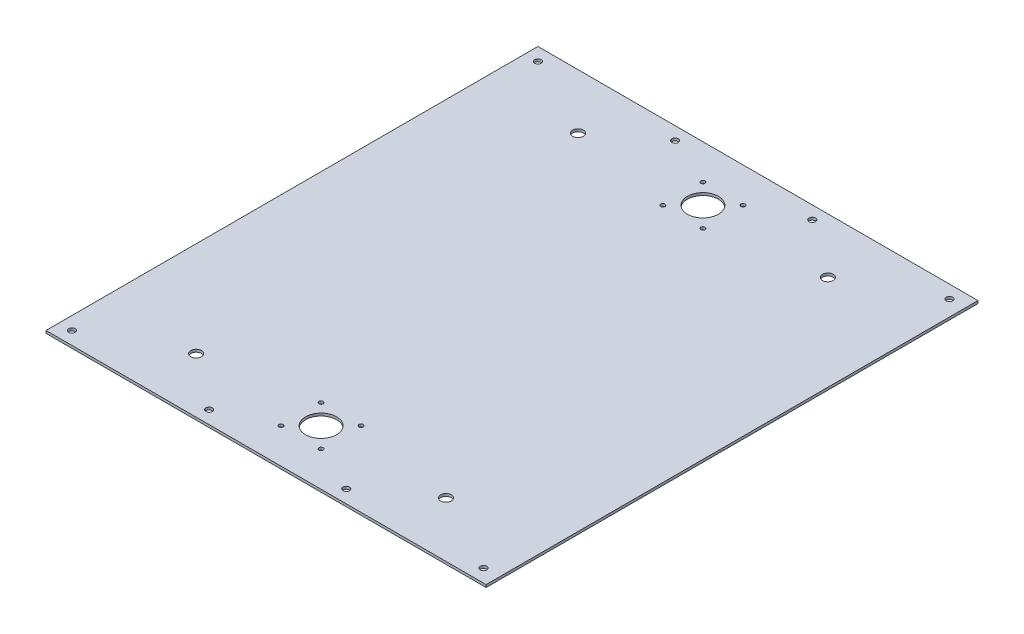
ISO-10303-21;
HEADER;
FILE_DESCRIPTION(('STEP AP214'),'2;1');
FILE_NAME('part.step','',(''),(''),'','','');
FILE_SCHEMA(('AUTOMOTIVE_DESIGN { 1 0 10303 214 1 1 1 1 }'));
ENDSEC;
DATA;
#1=APPLICATION_CONTEXT('core data for automotive mechanical design processes');
#2=APPLICATION_PROTOCOL_DEFINITION('international standard','automotive_design',2000,#1);
#3=PRODUCT_CONTEXT('',#1,'mechanical');
#4=PRODUCT('Part','Part','',(#3));
#5=PRODUCT_RELATED_PRODUCT_CATEGORY('part','',(#4));
#6=PRODUCT_DEFINITION_FORMATION('','',#4);
#7=PRODUCT_DEFINITION_CONTEXT('part definition',#1,'design');
#8=PRODUCT_DEFINITION('design','',#6,#7);
#9=PRODUCT_DEFINITION_SHAPE('','',#8);
#10=(LENGTH_UNIT() NAMED_UNIT(*) SI_UNIT(.MILLI.,.METRE.));
#11=(NAMED_UNIT(*) PLANE_ANGLE_UNIT() SI_UNIT($,.RADIAN.));
#12=(NAMED_UNIT(*) SI_UNIT($,.STERADIAN.) SOLID_ANGLE_UNIT());
#13=UNCERTAINTY_MEASURE_WITH_UNIT(LENGTH_MEASURE(1.E-05),#10,'distance_accuracy_value','');
#14=(GEOMETRIC_REPRESENTATION_CONTEXT(3) GLOBAL_UNCERTAINTY_ASSIGNED_CONTEXT((#13)) GLOBAL_UNIT_ASSIGNED_CONTEXT((#10,
#11,#12)) REPRESENTATION_CONTEXT('',''));
#15=CARTESIAN_POINT('',(0.,0.,0.));
#16=DIRECTION('',(0.,0.,1.));
#17=DIRECTION('',(1.,0.,0.));
#18=AXIS2_PLACEMENT_3D('',#15,#16,#17);
#19=CARTESIAN_POINT('',(0.,2.,0.));
#20=DIRECTION('',(0.,1.,0.));
#21=DIRECTION('',(0.,0.,1.));
#22=AXIS2_PLACEMENT_3D('',#19,#20,#21);
#23=PLANE('',#22);
#24=CARTESIAN_POINT('',(15.4999994388272,2.,-131.999999265587));
#25=DIRECTION('',(0.,-1.,0.));
#26=DIRECTION('',(0.,0.,-1.));
#27=AXIS2_PLACEMENT_3D('',#24,#25,#26);
#28=CIRCLE('',#27,1.64999961201001);
#29=CARTESIAN_POINT('',(15.4999994388272,2.,-133.649998877597));
#30=VERTEX_POINT('',#29);
#31=EDGE_CURVE('E194',#30,#30,#28,.T.);
#32=ORIENTED_EDGE('',*,*,#31,.T.);
#33=EDGE_LOOP('',(#32));
#34=FACE_BOUND('',#33,.T.);
#35=CARTESIAN_POINT('',(-15.5000005611728,2.,-131.999999265588));
#36=DIRECTION('',(0.,-1.,0.));
#37=DIRECTION('',(0.,0.,-1.));
#38=AXIS2_PLACEMENT_3D('',#35,#36,#37);
#39=CIRCLE('',#38,1.64999961201001);
#40=CARTESIAN_POINT('',(-15.5000005611728,2.,-133.649998877598));
#41=VERTEX_POINT('',#40);
#42=EDGE_CURVE('E201',#41,#41,#39,.T.);
#43=ORIENTED_EDGE('',*,*,#42,.T.);
#44=EDGE_LOOP('',(#43));
#45=FACE_BOUND('',#44,.T.);
#46=CARTESIAN_POINT('',(-15.5000005611726,2.,-162.999999265588));
#47=DIRECTION('',(0.,-1.,0.));
#48=DIRECTION('',(0.,0.,-1.));
#49=AXIS2_PLACEMENT_3D('',#46,#47,#48);
#50=CIRCLE('',#49,1.64999961201001);
#51=CARTESIAN_POINT('',(-15.5000005611726,2.,-164.649998877598));
#52=VERTEX_POINT('',#51);
#53=EDGE_CURVE('E207',#52,#52,#50,.T.);
#54=ORIENTED_EDGE('',*,*,#53,.T.);
#55=EDGE_LOOP('',(#54));
#56=FACE_BOUND('',#55,.T.);
#57=CARTESIAN_POINT('',(96.499999368108,2.,-147.499999005089));
#58=DIRECTION('',(0.,-1.,0.));
#59=DIRECTION('',(0.,0.,-1.));
#60=AXIS2_PLACEMENT_3D('',#57,#58,#59);
#61=CIRCLE('',#60,4.15000009933431);
#62=CARTESIAN_POINT('',(96.499999368108,2.,-151.649999104423));
#63=VERTEX_POINT('',#62);
#64=EDGE_CURVE('E183',#63,#63,#61,.T.);
#65=ORIENTED_EDGE('',*,*,#64,.T.);
#66=EDGE_LOOP('',(#65));
#67=FACE_BOUND('',#66,.T.);
#68=CARTESIAN_POINT('',(15.4999994388274,2.,-162.999999265587));
#69=DIRECTION('',(0.,-1.,0.));
#70=DIRECTION('',(0.,0.,-1.));
#71=AXIS2_PLACEMENT_3D('',#68,#69,#70);
#72=CIRCLE('',#71,1.64999961201001);
#73=CARTESIAN_POINT('',(15.4999994388274,2.,-164.649998877597));
#74=VERTEX_POINT('',#73);
#75=EDGE_CURVE('E164',#74,#74,#72,.T.);
#76=ORIENTED_EDGE('',*,*,#75,.T.);
#77=EDGE_LOOP('',(#76));
#78=FACE_BOUND('',#77,.T.);
#79=CARTESIAN_POINT('',(-15.4999993894449,2.,162.999999867049));
#80=DIRECTION('',(0.,-1.,0.));
#81=DIRECTION('',(0.,0.,-1.));
#82=AXIS2_PLACEMENT_3D('',#79,#80,#81);
#83=CIRCLE('',#82,1.65000019614936);
#84=CARTESIAN_POINT('',(-15.4999993894449,2.,161.3499996709));
#85=VERTEX_POINT('',#84);
#86=EDGE_CURVE('E170',#85,#85,#83,.T.);
#87=ORIENTED_EDGE('',*,*,#86,.T.);
#88=EDGE_LOOP('',(#87));
#89=FACE_BOUND('',#88,.T.);
#90=CARTESIAN_POINT('',(-15.4999993894446,2.,131.999999867049));
#91=DIRECTION('',(0.,-1.,0.));
#92=DIRECTION('',(0.,0.,-1.));
#93=AXIS2_PLACEMENT_3D('',#90,#91,#92);
#94=CIRCLE('',#93,1.65000019614936);
#95=CARTESIAN_POINT('',(-15.4999993894446,2.,130.3499996709));
#96=VERTEX_POINT('',#95);
#97=EDGE_CURVE('E171',#96,#96,#94,.T.);
#98=ORIENTED_EDGE('',*,*,#97,.T.);
#99=EDGE_LOOP('',(#98));
#100=FACE_BOUND('',#99,.T.);
#101=CARTESIAN_POINT('',(15.5000006105554,2.,131.999999867049));
#102=DIRECTION('',(0.,-1.,0.));
#103=DIRECTION('',(0.,0.,-1.));
#104=AXIS2_PLACEMENT_3D('',#101,#102,#103);
#105=CIRCLE('',#104,1.65000019614936);
#106=CARTESIAN_POINT('',(15.5000006105554,2.,130.3499996709));
#107=VERTEX_POINT('',#106);
#108=EDGE_CURVE('E182',#107,#107,#105,.T.);
#109=ORIENTED_EDGE('',*,*,#108,.T.);
#110=EDGE_LOOP('',(#109));
#111=FACE_BOUND('',#110,.T.);
#112=CARTESIAN_POINT('',(0.,2.,147.499999035042));
#113=DIRECTION('',(0.,-1.,0.));
#114=DIRECTION('',(0.,0.,-1.));
#115=AXIS2_PLACEMENT_3D('',#112,#113,#114);
#116=CIRCLE('',#115,12.);
#117=CARTESIAN_POINT('',(0.,2.,135.499999035042));
#118=VERTEX_POINT('',#117);
#119=EDGE_CURVE('E219',#118,#118,#116,.T.);
#120=ORIENTED_EDGE('',*,*,#119,.T.);
#121=EDGE_LOOP('',(#120));
#122=FACE_BOUND('',#121,.T.);
#123=CARTESIAN_POINT('',(0.,2.,-147.499999158167));
#124=DIRECTION('',(0.,-1.,0.));
#125=DIRECTION('',(0.,0.,-1.));
#126=AXIS2_PLACEMENT_3D('',#123,#124,#125);
#127=CIRCLE('',#126,12.);
#128=CARTESIAN_POINT('',(0.,2.,-159.499999158167));
#129=VERTEX_POINT('',#128);
#130=EDGE_CURVE('E218',#129,#129,#127,.T.);
#131=ORIENTED_EDGE('',*,*,#130,.T.);
#132=EDGE_LOOP('',(#131));
#133=FACE_BOUND('',#132,.T.);
#134=CARTESIAN_POINT('',(96.4999995632542,2.,147.499999035042));
#135=DIRECTION('',(0.,-1.,0.));
#136=DIRECTION('',(0.,0.,-1.));
#137=AXIS2_PLACEMENT_3D('',#134,#135,#136);
#138=CIRCLE('',#137,4.15000002607921);
#139=CARTESIAN_POINT('',(96.4999995632542,2.,143.349999008963));
#140=VERTEX_POINT('',#139);
#141=EDGE_CURVE('E225',#140,#140,#138,.T.);
#142=ORIENTED_EDGE('',*,*,#141,.T.);
#143=EDGE_LOOP('',(#142));
#144=FACE_BOUND('',#143,.T.);
#145=CARTESIAN_POINT('',(-96.5000178161831,2.,147.499999068419));
#146=DIRECTION('',(0.,-1.,0.));
#147=DIRECTION('',(0.,0.,-1.));
#148=AXIS2_PLACEMENT_3D('',#145,#146,#147);
#149=CIRCLE('',#148,4.14999997483809);
#150=CARTESIAN_POINT('',(-96.5000178161831,2.,143.349999093581));
#151=VERTEX_POINT('',#150);
#152=EDGE_CURVE('E231',#151,#151,#149,.T.);
#153=ORIENTED_EDGE('',*,*,#152,.T.);
#154=EDGE_LOOP('',(#153));
#155=FACE_BOUND('',#154,.T.);
#156=CARTESIAN_POINT('',(-96.4999996591489,2.,-147.499999158167));
#157=DIRECTION('',(0.,-1.,0.));
#158=DIRECTION('',(0.,0.,-1.));
#159=AXIS2_PLACEMENT_3D('',#156,#157,#158);
#160=CIRCLE('',#159,4.14999992410953);
#161=CARTESIAN_POINT('',(-96.4999996591489,2.,-151.649999082277));
#162=VERTEX_POINT('',#161);
#163=EDGE_CURVE('E195',#162,#162,#160,.T.);
#164=ORIENTED_EDGE('',*,*,#163,.T.);
#165=EDGE_LOOP('',(#164));
#166=FACE_BOUND('',#165,.T.);
#167=CARTESIAN_POINT('',(15.5000006105551,2.,162.999999867049));
#168=DIRECTION('',(0.,-1.,0.));
#169=DIRECTION('',(0.,0.,-1.));
#170=AXIS2_PLACEMENT_3D('',#167,#168,#169);
#171=CIRCLE('',#170,1.65000019614936);
#172=CARTESIAN_POINT('',(15.5000006105551,2.,161.3499996709));
#173=VERTEX_POINT('',#172);
#174=EDGE_CURVE('E158',#173,#173,#171,.T.);
#175=ORIENTED_EDGE('',*,*,#174,.T.);
#176=EDGE_LOOP('',(#175));
#177=FACE_BOUND('',#176,.T.);
#178=CARTESIAN_POINT('',(158.000000000004,2.,180.));
#179=DIRECTION('',(0.,1.,0.));
#180=DIRECTION('',(0.,0.,1.));
#181=AXIS2_PLACEMENT_3D('',#178,#179,#180);
#182=CIRCLE('',#181,2.5);
#183=CARTESIAN_POINT('',(158.000000000004,2.,182.5));
#184=VERTEX_POINT('',#183);
#185=EDGE_CURVE('E146',#184,#184,#182,.T.);
#186=ORIENTED_EDGE('',*,*,#185,.F.);
#187=EDGE_LOOP('',(#186));
#188=FACE_BOUND('',#187,.T.);
#189=CARTESIAN_POINT('',(-53.9999999999962,2.,180.));
#190=DIRECTION('',(0.,1.,0.));
#191=DIRECTION('',(0.,0.,1.));
#192=AXIS2_PLACEMENT_3D('',#189,#190,#191);
#193=CIRCLE('',#192,2.5);
#194=CARTESIAN_POINT('',(-53.9999999999962,2.,182.5));
#195=VERTEX_POINT('',#194);
#196=EDGE_CURVE('E134',#195,#195,#193,.T.);
#197=ORIENTED_EDGE('',*,*,#196,.F.);
#198=EDGE_LOOP('',(#197));
#199=FACE_BOUND('',#198,.T.);
#200=CARTESIAN_POINT('',(52.,2.,-180.));
#201=DIRECTION('',(0.,1.,0.));
#202=DIRECTION('',(0.,0.,1.));
#203=AXIS2_PLACEMENT_3D('',#200,#201,#202);
#204=CIRCLE('',#203,2.5);
#205=CARTESIAN_POINT('',(52.,2.,-177.5));
#206=VERTEX_POINT('',#205);
#207=EDGE_CURVE('E122',#206,#206,#204,.T.);
#208=ORIENTED_EDGE('',*,*,#207,.F.);
#209=EDGE_LOOP('',(#208));
#210=FACE_BOUND('',#209,.T.);
#211=CARTESIAN_POINT('',(-160.,2.,-180.));
#212=DIRECTION('',(0.,1.,0.));
#213=DIRECTION('',(0.,0.,1.));
#214=AXIS2_PLACEMENT_3D('',#211,#212,#213);
#215=CIRCLE('',#214,2.5);
#216=CARTESIAN_POINT('',(-160.,2.,-177.5));
#217=VERTEX_POINT('',#216);
#218=EDGE_CURVE('E101',#217,#217,#215,.T.);
#219=ORIENTED_EDGE('',*,*,#218,.F.);
#220=EDGE_LOOP('',(#219));
#221=FACE_BOUND('',#220,.T.);
#222=DIRECTION('',(0.,0.,1.));
#223=VECTOR('',#222,1.);
#224=CARTESIAN_POINT('',(-170.,2.,190.));
#225=LINE('',#224,#223);
#226=CARTESIAN_POINT('',(-170.,2.,-190.));
#227=VERTEX_POINT('',#226);
#228=CARTESIAN_POINT('',(-170.,2.,190.));
#229=VERTEX_POINT('',#228);
#230=EDGE_CURVE('E86',#227,#229,#225,.T.);
#231=ORIENTED_EDGE('',*,*,#230,.T.);
#232=DIRECTION('',(1.,0.,0.));
#233=VECTOR('',#232,1.);
#234=CARTESIAN_POINT('',(170.,2.,190.));
#235=LINE('',#234,#233);
#236=CARTESIAN_POINT('',(170.,2.,190.));
#237=VERTEX_POINT('',#236);
#238=EDGE_CURVE('E81',#229,#237,#235,.T.);
#239=ORIENTED_EDGE('',*,*,#238,.T.);
#240=DIRECTION('',(0.,0.,-1.));
#241=VECTOR('',#240,1.);
#242=CARTESIAN_POINT('',(170.,2.,190.));
#243=LINE('',#242,#241);
#244=CARTESIAN_POINT('',(170.,2.,-190.));
#245=VERTEX_POINT('',#244);
#246=EDGE_CURVE('E84',#237,#245,#243,.T.);
#247=ORIENTED_EDGE('',*,*,#246,.T.);
#248=DIRECTION('',(-1.,0.,0.));
#249=VECTOR('',#248,1.);
#250=CARTESIAN_POINT('',(170.,2.,-190.));
#251=LINE('',#250,#249);
#252=EDGE_CURVE('E51',#245,#227,#251,.T.);
#253=ORIENTED_EDGE('',*,*,#252,.T.);
#254=EDGE_LOOP('',(#231,#239,#247,#253));
#255=FACE_BOUND('',#254,.T.);
#256=CARTESIAN_POINT('',(-54.,2.,-180.));
#257=DIRECTION('',(0.,1.,0.));
#258=DIRECTION('',(0.,0.,1.));
#259=AXIS2_PLACEMENT_3D('',#256,#257,#258);
#260=CIRCLE('',#259,2.5);
#261=CARTESIAN_POINT('',(-54.,2.,-177.5));
#262=VERTEX_POINT('',#261);
#263=EDGE_CURVE('E116',#262,#262,#260,.T.);
#264=ORIENTED_EDGE('',*,*,#263,.F.);
#265=EDGE_LOOP('',(#264));
#266=FACE_BOUND('',#265,.T.);
#267=CARTESIAN_POINT('',(158.,2.,-180.));
#268=DIRECTION('',(0.,1.,0.));
#269=DIRECTION('',(0.,0.,1.));
#270=AXIS2_PLACEMENT_3D('',#267,#268,#269);
#271=CIRCLE('',#270,2.5);
#272=CARTESIAN_POINT('',(158.,2.,-177.5));
#273=VERTEX_POINT('',#272);
#274=EDGE_CURVE('E128',#273,#273,#271,.T.);
#275=ORIENTED_EDGE('',*,*,#274,.F.);
#276=EDGE_LOOP('',(#275));
#277=FACE_BOUND('',#276,.T.);
#278=CARTESIAN_POINT('',(52.0000000000038,2.,180.));
#279=DIRECTION('',(0.,1.,0.));
#280=DIRECTION('',(0.,0.,1.));
#281=AXIS2_PLACEMENT_3D('',#278,#279,#280);
#282=CIRCLE('',#281,2.5);
#283=CARTESIAN_POINT('',(52.0000000000038,2.,182.5));
#284=VERTEX_POINT('',#283);
#285=EDGE_CURVE('E140',#284,#284,#282,.T.);
#286=ORIENTED_EDGE('',*,*,#285,.F.);
#287=EDGE_LOOP('',(#286));
#288=FACE_BOUND('',#287,.T.);
#289=CARTESIAN_POINT('',(-159.999999999996,2.,180.));
#290=DIRECTION('',(0.,1.,0.));
#291=DIRECTION('',(0.,0.,1.));
#292=AXIS2_PLACEMENT_3D('',#289,#290,#291);
#293=CIRCLE('',#292,2.5);
#294=CARTESIAN_POINT('',(-159.999999999996,2.,182.5));
#295=VERTEX_POINT('',#294);
#296=EDGE_CURVE('E152',#295,#295,#293,.T.);
#297=ORIENTED_EDGE('',*,*,#296,.F.);
#298=EDGE_LOOP('',(#297));
#299=FACE_BOUND('',#298,.T.);
#300=ADVANCED_FACE('F34',(#34,#45,#56,#67,#78,#89,#100,#111,#122,#133,#144,#155,#166,#177,#188,
#199,#210,#221,#255,#266,#277,#288,#299),#23,.T.);
#301=CARTESIAN_POINT('',(0.,0.,0.));
#302=DIRECTION('',(0.,1.,0.));
#303=DIRECTION('',(0.,0.,1.));
#304=AXIS2_PLACEMENT_3D('',#301,#302,#303);
#305=PLANE('',#304);
#306=CARTESIAN_POINT('',(15.4999994388272,0.,-131.999999265587));
#307=DIRECTION('',(0.,-1.,0.));
#308=DIRECTION('',(0.,0.,-1.));
#309=AXIS2_PLACEMENT_3D('',#306,#307,#308);
#310=CIRCLE('',#309,1.64999961201001);
#311=CARTESIAN_POINT('',(15.4999994388272,0.,-133.649998877597));
#312=VERTEX_POINT('',#311);
#313=EDGE_CURVE('E191',#312,#312,#310,.T.);
#314=ORIENTED_EDGE('',*,*,#313,.F.);
#315=EDGE_LOOP('',(#314));
#316=FACE_BOUND('',#315,.T.);
#317=CARTESIAN_POINT('',(-15.5000005611728,0.,-131.999999265588));
#318=DIRECTION('',(0.,-1.,0.));
#319=DIRECTION('',(0.,0.,-1.));
#320=AXIS2_PLACEMENT_3D('',#317,#318,#319);
#321=CIRCLE('',#320,1.64999961201001);
#322=CARTESIAN_POINT('',(-15.5000005611728,0.,-133.649998877598));
#323=VERTEX_POINT('',#322);
#324=EDGE_CURVE('E198',#323,#323,#321,.T.);
#325=ORIENTED_EDGE('',*,*,#324,.F.);
#326=EDGE_LOOP('',(#325));
#327=FACE_BOUND('',#326,.T.);
#328=CARTESIAN_POINT('',(-15.5000005611726,0.,-162.999999265588));
#329=DIRECTION('',(0.,-1.,0.));
#330=DIRECTION('',(0.,0.,-1.));
#331=AXIS2_PLACEMENT_3D('',#328,#329,#330);
#332=CIRCLE('',#331,1.64999961201001);
#333=CARTESIAN_POINT('',(-15.5000005611726,0.,-164.649998877598));
#334=VERTEX_POINT('',#333);
#335=EDGE_CURVE('E204',#334,#334,#332,.T.);
#336=ORIENTED_EDGE('',*,*,#335,.F.);
#337=EDGE_LOOP('',(#336));
#338=FACE_BOUND('',#337,.T.);
#339=CARTESIAN_POINT('',(96.499999368108,0.,-147.499999005089));
#340=DIRECTION('',(0.,-1.,0.));
#341=DIRECTION('',(0.,0.,-1.));
#342=AXIS2_PLACEMENT_3D('',#339,#340,#341);
#343=CIRCLE('',#342,4.15000009933431);
#344=CARTESIAN_POINT('',(96.499999368108,0.,-151.649999104423));
#345=VERTEX_POINT('',#344);
#346=EDGE_CURVE('E210',#345,#345,#343,.T.);
#347=ORIENTED_EDGE('',*,*,#346,.F.);
#348=EDGE_LOOP('',(#347));
#349=FACE_BOUND('',#348,.T.);
#350=CARTESIAN_POINT('',(15.4999994388274,0.,-162.999999265587));
#351=DIRECTION('',(0.,-1.,0.));
#352=DIRECTION('',(0.,0.,-1.));
#353=AXIS2_PLACEMENT_3D('',#350,#351,#352);
#354=CIRCLE('',#353,1.64999961201001);
#355=CARTESIAN_POINT('',(15.4999994388274,0.,-164.649998877597));
#356=VERTEX_POINT('',#355);
#357=EDGE_CURVE('E174',#356,#356,#354,.T.);
#358=ORIENTED_EDGE('',*,*,#357,.F.);
#359=EDGE_LOOP('',(#358));
#360=FACE_BOUND('',#359,.T.);
#361=CARTESIAN_POINT('',(-15.4999993894449,0.,162.999999867049));
#362=DIRECTION('',(0.,-1.,0.));
#363=DIRECTION('',(0.,0.,-1.));
#364=AXIS2_PLACEMENT_3D('',#361,#362,#363);
#365=CIRCLE('',#364,1.65000019614936);
#366=CARTESIAN_POINT('',(-15.4999993894449,0.,161.3499996709));
#367=VERTEX_POINT('',#366);
#368=EDGE_CURVE('E167',#367,#367,#365,.T.);
#369=ORIENTED_EDGE('',*,*,#368,.F.);
#370=EDGE_LOOP('',(#369));
#371=FACE_BOUND('',#370,.T.);
#372=CARTESIAN_POINT('',(-15.4999993894446,0.,131.999999867049));
#373=DIRECTION('',(0.,-1.,0.));
#374=DIRECTION('',(0.,0.,-1.));
#375=AXIS2_PLACEMENT_3D('',#372,#373,#374);
#376=CIRCLE('',#375,1.65000019614936);
#377=CARTESIAN_POINT('',(-15.4999993894446,0.,130.3499996709));
#378=VERTEX_POINT('',#377);
#379=EDGE_CURVE('E186',#378,#378,#376,.T.);
#380=ORIENTED_EDGE('',*,*,#379,.F.);
#381=EDGE_LOOP('',(#380));
#382=FACE_BOUND('',#381,.T.);
#383=CARTESIAN_POINT('',(15.5000006105554,0.,131.999999867049));
#384=DIRECTION('',(0.,-1.,0.));
#385=DIRECTION('',(0.,0.,-1.));
#386=AXIS2_PLACEMENT_3D('',#383,#384,#385);
#387=CIRCLE('',#386,1.65000019614936);
#388=CARTESIAN_POINT('',(15.5000006105554,0.,130.3499996709));
#389=VERTEX_POINT('',#388);
#390=EDGE_CURVE('E179',#389,#389,#387,.T.);
#391=ORIENTED_EDGE('',*,*,#390,.F.);
#392=EDGE_LOOP('',(#391));
#393=FACE_BOUND('',#392,.T.);
#394=CARTESIAN_POINT('',(0.,0.,147.499999035042));
#395=DIRECTION('',(0.,-1.,0.));
#396=DIRECTION('',(0.,0.,-1.));
#397=AXIS2_PLACEMENT_3D('',#394,#395,#396);
#398=CIRCLE('',#397,12.);
#399=CARTESIAN_POINT('',(0.,0.,135.499999035042));
#400=VERTEX_POINT('',#399);
#401=EDGE_CURVE('E239',#400,#400,#398,.T.);
#402=ORIENTED_EDGE('',*,*,#401,.F.);
#403=EDGE_LOOP('',(#402));
#404=FACE_BOUND('',#403,.T.);
#405=CARTESIAN_POINT('',(0.,0.,-147.499999158167));
#406=DIRECTION('',(0.,-1.,0.));
#407=DIRECTION('',(0.,0.,-1.));
#408=AXIS2_PLACEMENT_3D('',#405,#406,#407);
#409=CIRCLE('',#408,12.);
#410=CARTESIAN_POINT('',(0.,0.,-159.499999158167));
#411=VERTEX_POINT('',#410);
#412=EDGE_CURVE('E215',#411,#411,#409,.T.);
#413=ORIENTED_EDGE('',*,*,#412,.F.);
#414=EDGE_LOOP('',(#413));
#415=FACE_BOUND('',#414,.T.);
#416=CARTESIAN_POINT('',(96.4999995632542,0.,147.499999035042));
#417=DIRECTION('',(0.,-1.,0.));
#418=DIRECTION('',(0.,0.,-1.));
#419=AXIS2_PLACEMENT_3D('',#416,#417,#418);
#420=CIRCLE('',#419,4.15000002607921);
#421=CARTESIAN_POINT('',(96.4999995632542,0.,143.349999008963));
#422=VERTEX_POINT('',#421);
#423=EDGE_CURVE('E222',#422,#422,#420,.T.);
#424=ORIENTED_EDGE('',*,*,#423,.F.);
#425=EDGE_LOOP('',(#424));
#426=FACE_BOUND('',#425,.T.);
#427=CARTESIAN_POINT('',(-96.5000178161831,0.,147.499999068419));
#428=DIRECTION('',(0.,-1.,0.));
#429=DIRECTION('',(0.,0.,-1.));
#430=AXIS2_PLACEMENT_3D('',#427,#428,#429);
#431=CIRCLE('',#430,4.14999997483809);
#432=CARTESIAN_POINT('',(-96.5000178161831,0.,143.349999093581));
#433=VERTEX_POINT('',#432);
#434=EDGE_CURVE('E228',#433,#433,#431,.T.);
#435=ORIENTED_EDGE('',*,*,#434,.F.);
#436=EDGE_LOOP('',(#435));
#437=FACE_BOUND('',#436,.T.);
#438=CARTESIAN_POINT('',(-96.4999996591489,0.,-147.499999158167));
#439=DIRECTION('',(0.,-1.,0.));
#440=DIRECTION('',(0.,0.,-1.));
#441=AXIS2_PLACEMENT_3D('',#438,#439,#440);
#442=CIRCLE('',#441,4.14999992410953);
#443=CARTESIAN_POINT('',(-96.4999996591489,0.,-151.649999082277));
#444=VERTEX_POINT('',#443);
#445=EDGE_CURVE('E234',#444,#444,#442,.T.);
#446=ORIENTED_EDGE('',*,*,#445,.F.);
#447=EDGE_LOOP('',(#446));
#448=FACE_BOUND('',#447,.T.);
#449=CARTESIAN_POINT('',(15.5000006105551,0.,162.999999867049));
#450=DIRECTION('',(0.,-1.,0.));
#451=DIRECTION('',(0.,0.,-1.));
#452=AXIS2_PLACEMENT_3D('',#449,#450,#451);
#453=CIRCLE('',#452,1.65000019614936);
#454=CARTESIAN_POINT('',(15.5000006105551,0.,161.3499996709));
#455=VERTEX_POINT('',#454);
#456=EDGE_CURVE('E161',#455,#455,#453,.T.);
#457=ORIENTED_EDGE('',*,*,#456,.F.);
#458=EDGE_LOOP('',(#457));
#459=FACE_BOUND('',#458,.T.);
#460=DIRECTION('',(0.,0.,1.));
#461=VECTOR('',#460,1.);
#462=CARTESIAN_POINT('',(-170.,0.,190.));
#463=LINE('',#462,#461);
#464=CARTESIAN_POINT('',(-170.,0.,-190.));
#465=VERTEX_POINT('',#464);
#466=CARTESIAN_POINT('',(-170.,0.,190.));
#467=VERTEX_POINT('',#466);
#468=EDGE_CURVE('E98',#465,#467,#463,.T.);
#469=ORIENTED_EDGE('',*,*,#468,.F.);
#470=DIRECTION('',(-1.,0.,0.));
#471=VECTOR('',#470,1.);
#472=CARTESIAN_POINT('',(170.,0.,-190.));
#473=LINE('',#472,#471);
#474=CARTESIAN_POINT('',(170.,0.,-190.));
#475=VERTEX_POINT('',#474);
#476=EDGE_CURVE('E74',#475,#465,#473,.T.);
#477=ORIENTED_EDGE('',*,*,#476,.F.);
#478=DIRECTION('',(0.,0.,-1.));
#479=VECTOR('',#478,1.);
#480=CARTESIAN_POINT('',(170.,0.,190.));
#481=LINE('',#480,#479);
#482=CARTESIAN_POINT('',(170.,0.,190.));
#483=VERTEX_POINT('',#482);
#484=EDGE_CURVE('E68',#483,#475,#481,.T.);
#485=ORIENTED_EDGE('',*,*,#484,.F.);
#486=DIRECTION('',(1.,0.,0.));
#487=VECTOR('',#486,1.);
#488=CARTESIAN_POINT('',(170.,0.,190.));
#489=LINE('',#488,#487);
#490=EDGE_CURVE('E90',#467,#483,#489,.T.);
#491=ORIENTED_EDGE('',*,*,#490,.F.);
#492=EDGE_LOOP('',(#469,#477,#485,#491));
#493=FACE_BOUND('',#492,.T.);
#494=CARTESIAN_POINT('',(-160.,0.,-180.));
#495=DIRECTION('',(0.,1.,0.));
#496=DIRECTION('',(0.,0.,1.));
#497=AXIS2_PLACEMENT_3D('',#494,#495,#496);
#498=CIRCLE('',#497,2.5);
#499=CARTESIAN_POINT('',(-160.,0.,-177.5));
#500=VERTEX_POINT('',#499);
#501=EDGE_CURVE('E113',#500,#500,#498,.T.);
#502=ORIENTED_EDGE('',*,*,#501,.T.);
#503=EDGE_LOOP('',(#502));
#504=FACE_BOUND('',#503,.T.);
#505=CARTESIAN_POINT('',(-54.,0.,-180.));
#506=DIRECTION('',(0.,1.,0.));
#507=DIRECTION('',(0.,0.,1.));
#508=AXIS2_PLACEMENT_3D('',#505,#506,#507);
#509=CIRCLE('',#508,2.5);
#510=CARTESIAN_POINT('',(-54.,0.,-177.5));
#511=VERTEX_POINT('',#510);
#512=EDGE_CURVE('E119',#511,#511,#509,.T.);
#513=ORIENTED_EDGE('',*,*,#512,.T.);
#514=EDGE_LOOP('',(#513));
#515=FACE_BOUND('',#514,.T.);
#516=CARTESIAN_POINT('',(52.,0.,-180.));
#517=DIRECTION('',(0.,1.,0.));
#518=DIRECTION('',(0.,0.,1.));
#519=AXIS2_PLACEMENT_3D('',#516,#517,#518);
#520=CIRCLE('',#519,2.5);
#521=CARTESIAN_POINT('',(52.,0.,-177.5));
#522=VERTEX_POINT('',#521);
#523=EDGE_CURVE('E125',#522,#522,#520,.T.);
#524=ORIENTED_EDGE('',*,*,#523,.T.);
#525=EDGE_LOOP('',(#524));
#526=FACE_BOUND('',#525,.T.);
#527=CARTESIAN_POINT('',(158.,0.,-180.));
#528=DIRECTION('',(0.,1.,0.));
#529=DIRECTION('',(0.,0.,1.));
#530=AXIS2_PLACEMENT_3D('',#527,#528,#529);
#531=CIRCLE('',#530,2.5);
#532=CARTESIAN_POINT('',(158.,0.,-177.5));
#533=VERTEX_POINT('',#532);
#534=EDGE_CURVE('E131',#533,#533,#531,.T.);
#535=ORIENTED_EDGE('',*,*,#534,.T.);
#536=EDGE_LOOP('',(#535));
#537=FACE_BOUND('',#536,.T.);
#538=CARTESIAN_POINT('',(-53.9999999999962,0.,180.));
#539=DIRECTION('',(0.,1.,0.));
#540=DIRECTION('',(0.,0.,1.));
#541=AXIS2_PLACEMENT_3D('',#538,#539,#540);
#542=CIRCLE('',#541,2.5);
#543=CARTESIAN_POINT('',(-53.9999999999962,0.,182.5));
#544=VERTEX_POINT('',#543);
#545=EDGE_CURVE('E137',#544,#544,#542,.T.);
#546=ORIENTED_EDGE('',*,*,#545,.T.);
#547=EDGE_LOOP('',(#546));
#548=FACE_BOUND('',#547,.T.);
#549=CARTESIAN_POINT('',(52.0000000000038,0.,180.));
#550=DIRECTION('',(0.,1.,0.));
#551=DIRECTION('',(0.,0.,1.));
#552=AXIS2_PLACEMENT_3D('',#549,#550,#551);
#553=CIRCLE('',#552,2.5);
#554=CARTESIAN_POINT('',(52.0000000000038,0.,182.5));
#555=VERTEX_POINT('',#554);
#556=EDGE_CURVE('E143',#555,#555,#553,.T.);
#557=ORIENTED_EDGE('',*,*,#556,.T.);
#558=EDGE_LOOP('',(#557));
#559=FACE_BOUND('',#558,.T.);
#560=CARTESIAN_POINT('',(158.000000000004,0.,180.));
#561=DIRECTION('',(0.,1.,0.));
#562=DIRECTION('',(0.,0.,1.));
#563=AXIS2_PLACEMENT_3D('',#560,#561,#562);
#564=CIRCLE('',#563,2.5);
#565=CARTESIAN_POINT('',(158.000000000004,0.,182.5));
#566=VERTEX_POINT('',#565);
#567=EDGE_CURVE('E149',#566,#566,#564,.T.);
#568=ORIENTED_EDGE('',*,*,#567,.T.);
#569=EDGE_LOOP('',(#568));
#570=FACE_BOUND('',#569,.T.);
#571=CARTESIAN_POINT('',(-159.999999999996,0.,180.));
#572=DIRECTION('',(0.,1.,0.));
#573=DIRECTION('',(0.,0.,1.));
#574=AXIS2_PLACEMENT_3D('',#571,#572,#573);
#575=CIRCLE('',#574,2.5);
#576=CARTESIAN_POINT('',(-159.999999999996,0.,182.5));
#577=VERTEX_POINT('',#576);
#578=EDGE_CURVE('E155',#577,#577,#575,.T.);
#579=ORIENTED_EDGE('',*,*,#578,.T.);
#580=EDGE_LOOP('',(#579));
#581=FACE_BOUND('',#580,.T.);
#582=ADVANCED_FACE('F109',(#316,#327,#338,#349,#360,#371,#382,#393,#404,#415,#426,#437,#448,
#459,#493,#504,#515,#526,#537,#548,#559,#570,#581),#305,.F.);
#583=CARTESIAN_POINT('',(-170.,2.,190.));
#584=DIRECTION('',(1.,0.,0.));
#585=DIRECTION('',(0.,0.,-1.));
#586=AXIS2_PLACEMENT_3D('',#583,#584,#585);
#587=PLANE('',#586);
#588=ORIENTED_EDGE('',*,*,#468,.T.);
#589=DIRECTION('',(0.,-1.,0.));
#590=VECTOR('',#589,1.);
#591=CARTESIAN_POINT('',(-170.,2.,190.));
#592=LINE('',#591,#590);
#593=EDGE_CURVE('E11',#229,#467,#592,.T.);
#594=ORIENTED_EDGE('',*,*,#593,.F.);
#595=ORIENTED_EDGE('',*,*,#230,.F.);
#596=DIRECTION('',(0.,-1.,0.));
#597=VECTOR('',#596,1.);
#598=CARTESIAN_POINT('',(-170.,2.,-190.));
#599=LINE('',#598,#597);
#600=EDGE_CURVE('E94',#227,#465,#599,.T.);
#601=ORIENTED_EDGE('',*,*,#600,.T.);
#602=EDGE_LOOP('',(#588,#594,#595,#601));
#603=FACE_BOUND('',#602,.T.);
#604=ADVANCED_FACE('F36',(#603),#587,.F.);
#605=CARTESIAN_POINT('',(170.,2.,190.));
#606=DIRECTION('',(0.,0.,-1.));
#607=DIRECTION('',(-1.,0.,0.));
#608=AXIS2_PLACEMENT_3D('',#605,#606,#607);
#609=PLANE('',#608);
#610=ORIENTED_EDGE('',*,*,#490,.T.);
#611=DIRECTION('',(0.,-1.,0.));
#612=VECTOR('',#611,1.);
#613=CARTESIAN_POINT('',(170.,2.,190.));
#614=LINE('',#613,#612);
#615=EDGE_CURVE('E43',#237,#483,#614,.T.);
#616=ORIENTED_EDGE('',*,*,#615,.F.);
#617=ORIENTED_EDGE('',*,*,#238,.F.);
#618=ORIENTED_EDGE('',*,*,#593,.T.);
#619=EDGE_LOOP('',(#610,#616,#617,#618));
#620=FACE_BOUND('',#619,.T.);
#621=ADVANCED_FACE('F89',(#620),#609,.F.);
#622=CARTESIAN_POINT('',(170.,2.,190.));
#623=DIRECTION('',(-1.,0.,0.));
#624=DIRECTION('',(0.,0.,1.));
#625=AXIS2_PLACEMENT_3D('',#622,#623,#624);
#626=PLANE('',#625);
#627=ORIENTED_EDGE('',*,*,#484,.T.);
#628=DIRECTION('',(0.,-1.,0.));
#629=VECTOR('',#628,1.);
#630=CARTESIAN_POINT('',(170.,2.,-190.));
#631=LINE('',#630,#629);
#632=EDGE_CURVE('E91',#245,#475,#631,.T.);
#633=ORIENTED_EDGE('',*,*,#632,.F.);
#634=ORIENTED_EDGE('',*,*,#246,.F.);
#635=ORIENTED_EDGE('',*,*,#615,.T.);
#636=EDGE_LOOP('',(#627,#633,#634,#635));
#637=FACE_BOUND('',#636,.T.);
#638=ADVANCED_FACE('F92',(#637),#626,.F.);
#639=CARTESIAN_POINT('',(170.,2.,-190.));
#640=DIRECTION('',(0.,0.,1.));
#641=DIRECTION('',(1.,0.,0.));
#642=AXIS2_PLACEMENT_3D('',#639,#640,#641);
#643=PLANE('',#642);
#644=ORIENTED_EDGE('',*,*,#476,.T.);
#645=ORIENTED_EDGE('',*,*,#600,.F.);
#646=ORIENTED_EDGE('',*,*,#252,.F.);
#647=ORIENTED_EDGE('',*,*,#632,.T.);
#648=EDGE_LOOP('',(#644,#645,#646,#647));
#649=FACE_BOUND('',#648,.T.);
#650=ADVANCED_FACE('F106',(#649),#643,.F.);
#651=CARTESIAN_POINT('',(-160.,2.,-180.));
#652=DIRECTION('',(0.,-1.,0.));
#653=DIRECTION('',(0.,0.,-1.));
#654=AXIS2_PLACEMENT_3D('',#651,#652,#653);
#655=CYLINDRICAL_SURFACE('',#654,2.5);
#656=ORIENTED_EDGE('',*,*,#218,.T.);
#657=EDGE_LOOP('',(#656));
#658=FACE_BOUND('',#657,.T.);
#659=ORIENTED_EDGE('',*,*,#501,.F.);
#660=EDGE_LOOP('',(#659));
#661=FACE_BOUND('',#660,.T.);
#662=ADVANCED_FACE('F294',(#658,#661),#655,.F.);
#663=CARTESIAN_POINT('',(-54.,2.,-180.));
#664=DIRECTION('',(0.,-1.,0.));
#665=DIRECTION('',(0.,0.,-1.));
#666=AXIS2_PLACEMENT_3D('',#663,#664,#665);
#667=CYLINDRICAL_SURFACE('',#666,2.5);
#668=ORIENTED_EDGE('',*,*,#263,.T.);
#669=EDGE_LOOP('',(#668));
#670=FACE_BOUND('',#669,.T.);
#671=ORIENTED_EDGE('',*,*,#512,.F.);
#672=EDGE_LOOP('',(#671));
#673=FACE_BOUND('',#672,.T.);
#674=ADVANCED_FACE('F497',(#670,#673),#667,.F.);
#675=CARTESIAN_POINT('',(52.,2.,-180.));
#676=DIRECTION('',(0.,-1.,0.));
#677=DIRECTION('',(0.,0.,-1.));
#678=AXIS2_PLACEMENT_3D('',#675,#676,#677);
#679=CYLINDRICAL_SURFACE('',#678,2.5);
#680=ORIENTED_EDGE('',*,*,#207,.T.);
#681=EDGE_LOOP('',(#680));
#682=FACE_BOUND('',#681,.T.);
#683=ORIENTED_EDGE('',*,*,#523,.F.);
#684=EDGE_LOOP('',(#683));
#685=FACE_BOUND('',#684,.T.);
#686=ADVANCED_FACE('F532',(#682,#685),#679,.F.);
#687=CARTESIAN_POINT('',(158.,2.,-180.));
#688=DIRECTION('',(0.,-1.,0.));
#689=DIRECTION('',(0.,0.,-1.));
#690=AXIS2_PLACEMENT_3D('',#687,#688,#689);
#691=CYLINDRICAL_SURFACE('',#690,2.5);
#692=ORIENTED_EDGE('',*,*,#274,.T.);
#693=EDGE_LOOP('',(#692));
#694=FACE_BOUND('',#693,.T.);
#695=ORIENTED_EDGE('',*,*,#534,.F.);
#696=EDGE_LOOP('',(#695));
#697=FACE_BOUND('',#696,.T.);
#698=ADVANCED_FACE('F528',(#694,#697),#691,.F.);
#699=CARTESIAN_POINT('',(-53.9999999999962,2.,180.));
#700=DIRECTION('',(0.,-1.,0.));
#701=DIRECTION('',(0.,0.,-1.));
#702=AXIS2_PLACEMENT_3D('',#699,#700,#701);
#703=CYLINDRICAL_SURFACE('',#702,2.5);
#704=ORIENTED_EDGE('',*,*,#196,.T.);
#705=EDGE_LOOP('',(#704));
#706=FACE_BOUND('',#705,.T.);
#707=ORIENTED_EDGE('',*,*,#545,.F.);
#708=EDGE_LOOP('',(#707));
#709=FACE_BOUND('',#708,.T.);
#710=ADVANCED_FACE('F522',(#706,#709),#703,.F.);
#711=CARTESIAN_POINT('',(52.0000000000038,2.,180.));
#712=DIRECTION('',(0.,-1.,0.));
#713=DIRECTION('',(0.,0.,-1.));
#714=AXIS2_PLACEMENT_3D('',#711,#712,#713);
#715=CYLINDRICAL_SURFACE('',#714,2.5);
#716=ORIENTED_EDGE('',*,*,#285,.T.);
#717=EDGE_LOOP('',(#716));
#718=FACE_BOUND('',#717,.T.);
#719=ORIENTED_EDGE('',*,*,#556,.F.);
#720=EDGE_LOOP('',(#719));
#721=FACE_BOUND('',#720,.T.);
#722=ADVANCED_FACE('F516',(#718,#721),#715,.F.);
#723=CARTESIAN_POINT('',(158.000000000004,2.,180.));
#724=DIRECTION('',(0.,-1.,0.));
#725=DIRECTION('',(0.,0.,-1.));
#726=AXIS2_PLACEMENT_3D('',#723,#724,#725);
#727=CYLINDRICAL_SURFACE('',#726,2.5);
#728=ORIENTED_EDGE('',*,*,#185,.T.);
#729=EDGE_LOOP('',(#728));
#730=FACE_BOUND('',#729,.T.);
#731=ORIENTED_EDGE('',*,*,#567,.F.);
#732=EDGE_LOOP('',(#731));
#733=FACE_BOUND('',#732,.T.);
#734=ADVANCED_FACE('F282',(#730,#733),#727,.F.);
#735=CARTESIAN_POINT('',(-159.999999999996,2.,180.));
#736=DIRECTION('',(0.,-1.,0.));
#737=DIRECTION('',(0.,0.,-1.));
#738=AXIS2_PLACEMENT_3D('',#735,#736,#737);
#739=CYLINDRICAL_SURFACE('',#738,2.5);
#740=ORIENTED_EDGE('',*,*,#296,.T.);
#741=EDGE_LOOP('',(#740));
#742=FACE_BOUND('',#741,.T.);
#743=ORIENTED_EDGE('',*,*,#578,.F.);
#744=EDGE_LOOP('',(#743));
#745=FACE_BOUND('',#744,.T.);
#746=ADVANCED_FACE('F272',(#742,#745),#739,.F.);
#747=CARTESIAN_POINT('',(15.5000006105551,2.,162.999999867049));
#748=DIRECTION('',(0.,-1.,0.));
#749=DIRECTION('',(0.,0.,-1.));
#750=AXIS2_PLACEMENT_3D('',#747,#748,#749);
#751=CYLINDRICAL_SURFACE('',#750,1.65000019614936);
#752=ORIENTED_EDGE('',*,*,#174,.F.);
#753=EDGE_LOOP('',(#752));
#754=FACE_BOUND('',#753,.T.);
#755=ORIENTED_EDGE('',*,*,#456,.T.);
#756=EDGE_LOOP('',(#755));
#757=FACE_BOUND('',#756,.T.);
#758=ADVANCED_FACE('F269',(#754,#757),#751,.F.);
#759=CARTESIAN_POINT('',(-96.4999996591489,2.,-147.499999158167));
#760=DIRECTION('',(0.,-1.,0.));
#761=DIRECTION('',(0.,0.,-1.));
#762=AXIS2_PLACEMENT_3D('',#759,#760,#761);
#763=CYLINDRICAL_SURFACE('',#762,4.14999992410953);
#764=ORIENTED_EDGE('',*,*,#163,.F.);
#765=EDGE_LOOP('',(#764));
#766=FACE_BOUND('',#765,.T.);
#767=ORIENTED_EDGE('',*,*,#445,.T.);
#768=EDGE_LOOP('',(#767));
#769=FACE_BOUND('',#768,.T.);
#770=ADVANCED_FACE('F271',(#766,#769),#763,.F.);
#771=CARTESIAN_POINT('',(-96.5000178161831,2.,147.499999068419));
#772=DIRECTION('',(0.,-1.,0.));
#773=DIRECTION('',(0.,0.,-1.));
#774=AXIS2_PLACEMENT_3D('',#771,#772,#773);
#775=CYLINDRICAL_SURFACE('',#774,4.14999997483809);
#776=ORIENTED_EDGE('',*,*,#152,.F.);
#777=EDGE_LOOP('',(#776));
#778=FACE_BOUND('',#777,.T.);
#779=ORIENTED_EDGE('',*,*,#434,.T.);
#780=EDGE_LOOP('',(#779));
#781=FACE_BOUND('',#780,.T.);
#782=ADVANCED_FACE('F279',(#778,#781),#775,.F.);
#783=CARTESIAN_POINT('',(96.4999995632542,2.,147.499999035042));
#784=DIRECTION('',(0.,-1.,0.));
#785=DIRECTION('',(0.,0.,-1.));
#786=AXIS2_PLACEMENT_3D('',#783,#784,#785);
#787=CYLINDRICAL_SURFACE('',#786,4.15000002607921);
#788=ORIENTED_EDGE('',*,*,#141,.F.);
#789=EDGE_LOOP('',(#788));
#790=FACE_BOUND('',#789,.T.);
#791=ORIENTED_EDGE('',*,*,#423,.T.);
#792=EDGE_LOOP('',(#791));
#793=FACE_BOUND('',#792,.T.);
#794=ADVANCED_FACE('F333',(#790,#793),#787,.F.);
#795=CARTESIAN_POINT('',(0.,2.,-147.499999158167));
#796=DIRECTION('',(0.,-1.,0.));
#797=DIRECTION('',(0.,0.,-1.));
#798=AXIS2_PLACEMENT_3D('',#795,#796,#797);
#799=CYLINDRICAL_SURFACE('',#798,12.);
#800=ORIENTED_EDGE('',*,*,#130,.F.);
#801=EDGE_LOOP('',(#800));
#802=FACE_BOUND('',#801,.T.);
#803=ORIENTED_EDGE('',*,*,#412,.T.);
#804=EDGE_LOOP('',(#803));
#805=FACE_BOUND('',#804,.T.);
#806=ADVANCED_FACE('F251',(#802,#805),#799,.F.);
#807=CARTESIAN_POINT('',(0.,2.,147.499999035042));
#808=DIRECTION('',(0.,-1.,0.));
#809=DIRECTION('',(0.,0.,-1.));
#810=AXIS2_PLACEMENT_3D('',#807,#808,#809);
#811=CYLINDRICAL_SURFACE('',#810,12.);
#812=ORIENTED_EDGE('',*,*,#119,.F.);
#813=EDGE_LOOP('',(#812));
#814=FACE_BOUND('',#813,.T.);
#815=ORIENTED_EDGE('',*,*,#401,.T.);
#816=EDGE_LOOP('',(#815));
#817=FACE_BOUND('',#816,.T.);
#818=ADVANCED_FACE('F247',(#814,#817),#811,.F.);
#819=CARTESIAN_POINT('',(15.5000006105554,2.,131.999999867049));
#820=DIRECTION('',(0.,-1.,0.));
#821=DIRECTION('',(0.,0.,-1.));
#822=AXIS2_PLACEMENT_3D('',#819,#820,#821);
#823=CYLINDRICAL_SURFACE('',#822,1.65000019614936);
#824=ORIENTED_EDGE('',*,*,#108,.F.);
#825=EDGE_LOOP('',(#824));
#826=FACE_BOUND('',#825,.T.);
#827=ORIENTED_EDGE('',*,*,#390,.T.);
#828=EDGE_LOOP('',(#827));
#829=FACE_BOUND('',#828,.T.);
#830=ADVANCED_FACE('F250',(#826,#829),#823,.F.);
#831=CARTESIAN_POINT('',(-15.4999993894446,2.,131.999999867049));
#832=DIRECTION('',(0.,-1.,0.));
#833=DIRECTION('',(0.,0.,-1.));
#834=AXIS2_PLACEMENT_3D('',#831,#832,#833);
#835=CYLINDRICAL_SURFACE('',#834,1.65000019614936);
#836=ORIENTED_EDGE('',*,*,#97,.F.);
#837=EDGE_LOOP('',(#836));
#838=FACE_BOUND('',#837,.T.);
#839=ORIENTED_EDGE('',*,*,#379,.T.);
#840=EDGE_LOOP('',(#839));
#841=FACE_BOUND('',#840,.T.);
#842=ADVANCED_FACE('F367',(#838,#841),#835,.F.);
#843=CARTESIAN_POINT('',(-15.4999993894449,2.,162.999999867049));
#844=DIRECTION('',(0.,-1.,0.));
#845=DIRECTION('',(0.,0.,-1.));
#846=AXIS2_PLACEMENT_3D('',#843,#844,#845);
#847=CYLINDRICAL_SURFACE('',#846,1.65000019614936);
#848=ORIENTED_EDGE('',*,*,#86,.F.);
#849=EDGE_LOOP('',(#848));
#850=FACE_BOUND('',#849,.T.);
#851=ORIENTED_EDGE('',*,*,#368,.T.);
#852=EDGE_LOOP('',(#851));
#853=FACE_BOUND('',#852,.T.);
#854=ADVANCED_FACE('F377',(#850,#853),#847,.F.);
#855=CARTESIAN_POINT('',(15.4999994388274,2.,-162.999999265587));
#856=DIRECTION('',(0.,-1.,0.));
#857=DIRECTION('',(0.,0.,-1.));
#858=AXIS2_PLACEMENT_3D('',#855,#856,#857);
#859=CYLINDRICAL_SURFACE('',#858,1.64999961201001);
#860=ORIENTED_EDGE('',*,*,#75,.F.);
#861=EDGE_LOOP('',(#860));
#862=FACE_BOUND('',#861,.T.);
#863=ORIENTED_EDGE('',*,*,#357,.T.);
#864=EDGE_LOOP('',(#863));
#865=FACE_BOUND('',#864,.T.);
#866=ADVANCED_FACE('F387',(#862,#865),#859,.F.);
#867=CARTESIAN_POINT('',(96.499999368108,2.,-147.499999005089));
#868=DIRECTION('',(0.,-1.,0.));
#869=DIRECTION('',(0.,0.,-1.));
#870=AXIS2_PLACEMENT_3D('',#867,#868,#869);
#871=CYLINDRICAL_SURFACE('',#870,4.15000009933431);
#872=ORIENTED_EDGE('',*,*,#64,.F.);
#873=EDGE_LOOP('',(#872));
#874=FACE_BOUND('',#873,.T.);
#875=ORIENTED_EDGE('',*,*,#346,.T.);
#876=EDGE_LOOP('',(#875));
#877=FACE_BOUND('',#876,.T.);
#878=ADVANCED_FACE('F396',(#874,#877),#871,.F.);
#879=CARTESIAN_POINT('',(-15.5000005611726,2.,-162.999999265588));
#880=DIRECTION('',(0.,-1.,0.));
#881=DIRECTION('',(0.,0.,-1.));
#882=AXIS2_PLACEMENT_3D('',#879,#880,#881);
#883=CYLINDRICAL_SURFACE('',#882,1.64999961201001);
#884=ORIENTED_EDGE('',*,*,#53,.F.);
#885=EDGE_LOOP('',(#884));
#886=FACE_BOUND('',#885,.T.);
#887=ORIENTED_EDGE('',*,*,#335,.T.);
#888=EDGE_LOOP('',(#887));
#889=FACE_BOUND('',#888,.T.);
#890=ADVANCED_FACE('F406',(#886,#889),#883,.F.);
#891=CARTESIAN_POINT('',(-15.5000005611728,2.,-131.999999265588));
#892=DIRECTION('',(0.,-1.,0.));
#893=DIRECTION('',(0.,0.,-1.));
#894=AXIS2_PLACEMENT_3D('',#891,#892,#893);
#895=CYLINDRICAL_SURFACE('',#894,1.64999961201001);
#896=ORIENTED_EDGE('',*,*,#42,.F.);
#897=EDGE_LOOP('',(#896));
#898=FACE_BOUND('',#897,.T.);
#899=ORIENTED_EDGE('',*,*,#324,.T.);
#900=EDGE_LOOP('',(#899));
#901=FACE_BOUND('',#900,.T.);
#902=ADVANCED_FACE('F416',(#898,#901),#895,.F.);
#903=CARTESIAN_POINT('',(15.4999994388272,2.,-131.999999265587));
#904=DIRECTION('',(0.,-1.,0.));
#905=DIRECTION('',(0.,0.,-1.));
#906=AXIS2_PLACEMENT_3D('',#903,#904,#905);
#907=CYLINDRICAL_SURFACE('',#906,1.64999961201001);
#908=ORIENTED_EDGE('',*,*,#31,.F.);
#909=EDGE_LOOP('',(#908));
#910=FACE_BOUND('',#909,.T.);
#911=ORIENTED_EDGE('',*,*,#313,.T.);
#912=EDGE_LOOP('',(#911));
#913=FACE_BOUND('',#912,.T.);
#914=ADVANCED_FACE('F426',(#910,#913),#907,.F.);
#915=CLOSED_SHELL('',(#300,#582,#604,#621,#638,#650,#662,#674,#686,#698,#710,#722,#734,#746,
#758,#770,#782,#794,#806,#818,#830,#842,#854,#866,#878,#890,#902,#914));
#916=MANIFOLD_SOLID_BREP('B2',#915);
#917=ADVANCED_BREP_SHAPE_REPRESENTATION('',(#18,#916),#14);
#918=SHAPE_DEFINITION_REPRESENTATION(#9,#917);
ENDSEC;
END-ISO-10303-21;
